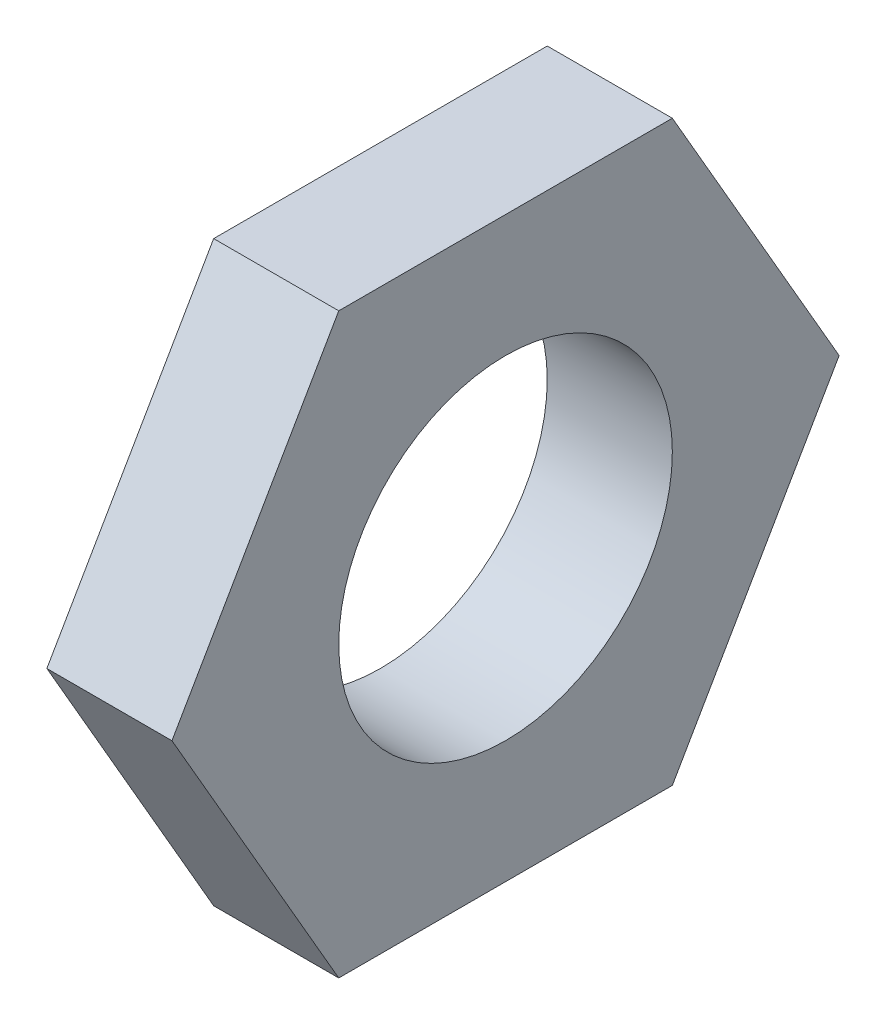
ISO-10303-21;
HEADER;
FILE_DESCRIPTION(('STEP AP214'),'2;1');
FILE_NAME('part.step','',(''),(''),'','','');
FILE_SCHEMA(('AUTOMOTIVE_DESIGN { 1 0 10303 214 1 1 1 1 }'));
ENDSEC;
DATA;
#1=APPLICATION_CONTEXT('core data for automotive mechanical design processes');
#2=APPLICATION_PROTOCOL_DEFINITION('international standard','automotive_design',2000,#1);
#3=PRODUCT_CONTEXT('',#1,'mechanical');
#4=PRODUCT('Part','Part','',(#3));
#5=PRODUCT_RELATED_PRODUCT_CATEGORY('part','',(#4));
#6=PRODUCT_DEFINITION_FORMATION('','',#4);
#7=PRODUCT_DEFINITION_CONTEXT('part definition',#1,'design');
#8=PRODUCT_DEFINITION('design','',#6,#7);
#9=PRODUCT_DEFINITION_SHAPE('','',#8);
#10=(LENGTH_UNIT() NAMED_UNIT(*) SI_UNIT(.MILLI.,.METRE.));
#11=(NAMED_UNIT(*) PLANE_ANGLE_UNIT() SI_UNIT($,.RADIAN.));
#12=(NAMED_UNIT(*) SI_UNIT($,.STERADIAN.) SOLID_ANGLE_UNIT());
#13=UNCERTAINTY_MEASURE_WITH_UNIT(LENGTH_MEASURE(1.E-05),#10,'distance_accuracy_value','');
#14=(GEOMETRIC_REPRESENTATION_CONTEXT(3) GLOBAL_UNCERTAINTY_ASSIGNED_CONTEXT((#13)) GLOBAL_UNIT_ASSIGNED_CONTEXT((#10,
#11,#12)) REPRESENTATION_CONTEXT('',''));
#15=CARTESIAN_POINT('',(0.,0.,0.));
#16=DIRECTION('',(0.,0.,1.));
#17=DIRECTION('',(1.,0.,0.));
#18=AXIS2_PLACEMENT_3D('',#15,#16,#17);
#19=CARTESIAN_POINT('',(3.,0.,0.));
#20=DIRECTION('',(1.,0.,0.));
#21=DIRECTION('',(0.,0.,-1.));
#22=AXIS2_PLACEMENT_3D('',#19,#20,#21);
#23=PLANE('',#22);
#24=DIRECTION('',(0.,0.866025403784439,-0.5));
#25=VECTOR('',#24,1.);
#26=CARTESIAN_POINT('',(3.,-6.92820323027551,-4.));
#27=LINE('',#26,#25);
#28=CARTESIAN_POINT('',(3.,-6.92820323027551,-4.));
#29=VERTEX_POINT('',#28);
#30=CARTESIAN_POINT('',(3.,0.,-8.));
#31=VERTEX_POINT('',#30);
#32=EDGE_CURVE('E129',#29,#31,#27,.T.);
#33=ORIENTED_EDGE('',*,*,#32,.T.);
#34=DIRECTION('',(0.,0.866025403784439,0.5));
#35=VECTOR('',#34,1.);
#36=CARTESIAN_POINT('',(3.,0.,-8.));
#37=LINE('',#36,#35);
#38=CARTESIAN_POINT('',(3.,6.92820323027551,-4.));
#39=VERTEX_POINT('',#38);
#40=EDGE_CURVE('E87',#31,#39,#37,.T.);
#41=ORIENTED_EDGE('',*,*,#40,.T.);
#42=DIRECTION('',(0.,0.,1.));
#43=VECTOR('',#42,1.);
#44=CARTESIAN_POINT('',(3.,6.92820323027551,-4.));
#45=LINE('',#44,#43);
#46=CARTESIAN_POINT('',(3.,6.92820323027551,4.));
#47=VERTEX_POINT('',#46);
#48=EDGE_CURVE('E100',#39,#47,#45,.T.);
#49=ORIENTED_EDGE('',*,*,#48,.T.);
#50=DIRECTION('',(0.,-0.866025403784439,0.5));
#51=VECTOR('',#50,1.);
#52=CARTESIAN_POINT('',(3.,6.92820323027551,4.));
#53=LINE('',#52,#51);
#54=CARTESIAN_POINT('',(3.,0.,8.));
#55=VERTEX_POINT('',#54);
#56=EDGE_CURVE('E94',#47,#55,#53,.T.);
#57=ORIENTED_EDGE('',*,*,#56,.T.);
#58=DIRECTION('',(0.,-0.866025403784439,-0.5));
#59=VECTOR('',#58,1.);
#60=CARTESIAN_POINT('',(3.,0.,8.));
#61=LINE('',#60,#59);
#62=CARTESIAN_POINT('',(3.,-6.92820323027551,4.));
#63=VERTEX_POINT('',#62);
#64=EDGE_CURVE('E98',#55,#63,#61,.T.);
#65=ORIENTED_EDGE('',*,*,#64,.T.);
#66=DIRECTION('',(0.,0.,-1.));
#67=VECTOR('',#66,1.);
#68=CARTESIAN_POINT('',(3.,-6.92820323027551,4.));
#69=LINE('',#68,#67);
#70=EDGE_CURVE('E50',#63,#29,#69,.T.);
#71=ORIENTED_EDGE('',*,*,#70,.T.);
#72=EDGE_LOOP('',(#33,#41,#49,#57,#65,#71));
#73=FACE_BOUND('',#72,.T.);
#74=CARTESIAN_POINT('',(3.,0.,0.));
#75=DIRECTION('',(1.,0.,0.));
#76=DIRECTION('',(0.,0.,-1.));
#77=AXIS2_PLACEMENT_3D('',#74,#75,#76);
#78=CIRCLE('',#77,4.);
#79=CARTESIAN_POINT('',(3.,0.,-4.));
#80=VERTEX_POINT('',#79);
#81=EDGE_CURVE('E122',#80,#80,#78,.T.);
#82=ORIENTED_EDGE('',*,*,#81,.F.);
#83=EDGE_LOOP('',(#82));
#84=FACE_BOUND('',#83,.T.);
#85=ADVANCED_FACE('F33',(#73,#84),#23,.T.);
#86=CARTESIAN_POINT('',(0.,0.,0.));
#87=DIRECTION('',(1.,0.,0.));
#88=DIRECTION('',(0.,0.,-1.));
#89=AXIS2_PLACEMENT_3D('',#86,#87,#88);
#90=PLANE('',#89);
#91=DIRECTION('',(0.,0.866025403784439,-0.5));
#92=VECTOR('',#91,1.);
#93=CARTESIAN_POINT('',(0.,-6.92820323027551,-4.));
#94=LINE('',#93,#92);
#95=CARTESIAN_POINT('',(0.,-6.92820323027551,-4.));
#96=VERTEX_POINT('',#95);
#97=CARTESIAN_POINT('',(0.,0.,-8.));
#98=VERTEX_POINT('',#97);
#99=EDGE_CURVE('E118',#96,#98,#94,.T.);
#100=ORIENTED_EDGE('',*,*,#99,.F.);
#101=DIRECTION('',(0.,0.,-1.));
#102=VECTOR('',#101,1.);
#103=CARTESIAN_POINT('',(0.,-6.92820323027551,4.));
#104=LINE('',#103,#102);
#105=CARTESIAN_POINT('',(0.,-6.92820323027551,4.));
#106=VERTEX_POINT('',#105);
#107=EDGE_CURVE('E79',#106,#96,#104,.T.);
#108=ORIENTED_EDGE('',*,*,#107,.F.);
#109=DIRECTION('',(0.,-0.866025403784439,-0.5));
#110=VECTOR('',#109,1.);
#111=CARTESIAN_POINT('',(0.,0.,8.));
#112=LINE('',#111,#110);
#113=CARTESIAN_POINT('',(0.,0.,8.));
#114=VERTEX_POINT('',#113);
#115=EDGE_CURVE('E73',#114,#106,#112,.T.);
#116=ORIENTED_EDGE('',*,*,#115,.F.);
#117=DIRECTION('',(0.,-0.866025403784439,0.5));
#118=VECTOR('',#117,1.);
#119=CARTESIAN_POINT('',(0.,6.92820323027551,4.));
#120=LINE('',#119,#118);
#121=CARTESIAN_POINT('',(0.,6.92820323027551,4.));
#122=VERTEX_POINT('',#121);
#123=EDGE_CURVE('E108',#122,#114,#120,.T.);
#124=ORIENTED_EDGE('',*,*,#123,.F.);
#125=DIRECTION('',(0.,0.,1.));
#126=VECTOR('',#125,1.);
#127=CARTESIAN_POINT('',(0.,6.92820323027551,-4.));
#128=LINE('',#127,#126);
#129=CARTESIAN_POINT('',(0.,6.92820323027551,-4.));
#130=VERTEX_POINT('',#129);
#131=EDGE_CURVE('E124',#130,#122,#128,.T.);
#132=ORIENTED_EDGE('',*,*,#131,.F.);
#133=DIRECTION('',(0.,0.866025403784439,0.5));
#134=VECTOR('',#133,1.);
#135=CARTESIAN_POINT('',(0.,0.,-8.));
#136=LINE('',#135,#134);
#137=EDGE_CURVE('E121',#98,#130,#136,.T.);
#138=ORIENTED_EDGE('',*,*,#137,.F.);
#139=EDGE_LOOP('',(#100,#108,#116,#124,#132,#138));
#140=FACE_BOUND('',#139,.T.);
#141=CARTESIAN_POINT('',(0.,0.,0.));
#142=DIRECTION('',(1.,0.,0.));
#143=DIRECTION('',(0.,0.,-1.));
#144=AXIS2_PLACEMENT_3D('',#141,#142,#143);
#145=CIRCLE('',#144,4.);
#146=CARTESIAN_POINT('',(0.,0.,-4.));
#147=VERTEX_POINT('',#146);
#148=EDGE_CURVE('E222',#147,#147,#145,.T.);
#149=ORIENTED_EDGE('',*,*,#148,.T.);
#150=EDGE_LOOP('',(#149));
#151=FACE_BOUND('',#150,.T.);
#152=ADVANCED_FACE('F138',(#140,#151),#90,.F.);
#153=CARTESIAN_POINT('',(3.,-6.92820323027551,-4.));
#154=DIRECTION('',(0.,0.5,0.866025403784439));
#155=DIRECTION('',(0.,-0.866025403784439,0.5));
#156=AXIS2_PLACEMENT_3D('',#153,#154,#155);
#157=PLANE('',#156);
#158=ORIENTED_EDGE('',*,*,#99,.T.);
#159=DIRECTION('',(-1.,0.,0.));
#160=VECTOR('',#159,1.);
#161=CARTESIAN_POINT('',(3.,0.,-8.));
#162=LINE('',#161,#160);
#163=EDGE_CURVE('E11',#31,#98,#162,.T.);
#164=ORIENTED_EDGE('',*,*,#163,.F.);
#165=ORIENTED_EDGE('',*,*,#32,.F.);
#166=DIRECTION('',(-1.,0.,0.));
#167=VECTOR('',#166,1.);
#168=CARTESIAN_POINT('',(3.,-6.92820323027551,-4.));
#169=LINE('',#168,#167);
#170=EDGE_CURVE('E114',#29,#96,#169,.T.);
#171=ORIENTED_EDGE('',*,*,#170,.T.);
#172=EDGE_LOOP('',(#158,#164,#165,#171));
#173=FACE_BOUND('',#172,.T.);
#174=ADVANCED_FACE('F35',(#173),#157,.F.);
#175=CARTESIAN_POINT('',(3.,0.,-8.));
#176=DIRECTION('',(0.,-0.5,0.866025403784439));
#177=DIRECTION('',(0.,-0.866025403784439,-0.5));
#178=AXIS2_PLACEMENT_3D('',#175,#176,#177);
#179=PLANE('',#178);
#180=ORIENTED_EDGE('',*,*,#137,.T.);
#181=DIRECTION('',(-1.,0.,0.));
#182=VECTOR('',#181,1.);
#183=CARTESIAN_POINT('',(3.,6.92820323027551,-4.));
#184=LINE('',#183,#182);
#185=EDGE_CURVE('E42',#39,#130,#184,.T.);
#186=ORIENTED_EDGE('',*,*,#185,.F.);
#187=ORIENTED_EDGE('',*,*,#40,.F.);
#188=ORIENTED_EDGE('',*,*,#163,.T.);
#189=EDGE_LOOP('',(#180,#186,#187,#188));
#190=FACE_BOUND('',#189,.T.);
#191=ADVANCED_FACE('F163',(#190),#179,.F.);
#192=CARTESIAN_POINT('',(3.,6.92820323027551,-4.));
#193=DIRECTION('',(0.,-1.,0.));
#194=DIRECTION('',(0.,0.,-1.));
#195=AXIS2_PLACEMENT_3D('',#192,#193,#194);
#196=PLANE('',#195);
#197=ORIENTED_EDGE('',*,*,#131,.T.);
#198=DIRECTION('',(-1.,0.,0.));
#199=VECTOR('',#198,1.);
#200=CARTESIAN_POINT('',(3.,6.92820323027551,4.));
#201=LINE('',#200,#199);
#202=EDGE_CURVE('E109',#47,#122,#201,.T.);
#203=ORIENTED_EDGE('',*,*,#202,.F.);
#204=ORIENTED_EDGE('',*,*,#48,.F.);
#205=ORIENTED_EDGE('',*,*,#185,.T.);
#206=EDGE_LOOP('',(#197,#203,#204,#205));
#207=FACE_BOUND('',#206,.T.);
#208=ADVANCED_FACE('F135',(#207),#196,.F.);
#209=CARTESIAN_POINT('',(3.,6.92820323027551,4.));
#210=DIRECTION('',(0.,-0.5,-0.866025403784438));
#211=DIRECTION('',(0.,0.866025403784439,-0.5));
#212=AXIS2_PLACEMENT_3D('',#209,#210,#211);
#213=PLANE('',#212);
#214=ORIENTED_EDGE('',*,*,#123,.T.);
#215=DIRECTION('',(-1.,0.,0.));
#216=VECTOR('',#215,1.);
#217=CARTESIAN_POINT('',(3.,0.,8.));
#218=LINE('',#217,#216);
#219=EDGE_CURVE('E105',#55,#114,#218,.T.);
#220=ORIENTED_EDGE('',*,*,#219,.F.);
#221=ORIENTED_EDGE('',*,*,#56,.F.);
#222=ORIENTED_EDGE('',*,*,#202,.T.);
#223=EDGE_LOOP('',(#214,#220,#221,#222));
#224=FACE_BOUND('',#223,.T.);
#225=ADVANCED_FACE('F106',(#224),#213,.F.);
#226=CARTESIAN_POINT('',(3.,0.,8.));
#227=DIRECTION('',(0.,0.5,-0.866025403784439));
#228=DIRECTION('',(0.,0.866025403784439,0.5));
#229=AXIS2_PLACEMENT_3D('',#226,#227,#228);
#230=PLANE('',#229);
#231=ORIENTED_EDGE('',*,*,#115,.T.);
#232=DIRECTION('',(-1.,0.,0.));
#233=VECTOR('',#232,1.);
#234=CARTESIAN_POINT('',(3.,-6.92820323027551,4.));
#235=LINE('',#234,#233);
#236=EDGE_CURVE('E110',#63,#106,#235,.T.);
#237=ORIENTED_EDGE('',*,*,#236,.F.);
#238=ORIENTED_EDGE('',*,*,#64,.F.);
#239=ORIENTED_EDGE('',*,*,#219,.T.);
#240=EDGE_LOOP('',(#231,#237,#238,#239));
#241=FACE_BOUND('',#240,.T.);
#242=ADVANCED_FACE('F112',(#241),#230,.F.);
#243=CARTESIAN_POINT('',(3.,-6.92820323027551,4.));
#244=DIRECTION('',(0.,1.,0.));
#245=DIRECTION('',(0.,0.,1.));
#246=AXIS2_PLACEMENT_3D('',#243,#244,#245);
#247=PLANE('',#246);
#248=ORIENTED_EDGE('',*,*,#107,.T.);
#249=ORIENTED_EDGE('',*,*,#170,.F.);
#250=ORIENTED_EDGE('',*,*,#70,.F.);
#251=ORIENTED_EDGE('',*,*,#236,.T.);
#252=EDGE_LOOP('',(#248,#249,#250,#251));
#253=FACE_BOUND('',#252,.T.);
#254=ADVANCED_FACE('F143',(#253),#247,.F.);
#255=CARTESIAN_POINT('',(3.,0.,0.));
#256=DIRECTION('',(-1.,0.,0.));
#257=DIRECTION('',(0.,0.,1.));
#258=AXIS2_PLACEMENT_3D('',#255,#256,#257);
#259=CYLINDRICAL_SURFACE('',#258,4.);
#260=ORIENTED_EDGE('',*,*,#81,.T.);
#261=EDGE_LOOP('',(#260));
#262=FACE_BOUND('',#261,.T.);
#263=ORIENTED_EDGE('',*,*,#148,.F.);
#264=EDGE_LOOP('',(#263));
#265=FACE_BOUND('',#264,.T.);
#266=ADVANCED_FACE('F145',(#262,#265),#259,.F.);
#267=CLOSED_SHELL('',(#85,#152,#174,#191,#208,#225,#242,#254,#266));
#268=MANIFOLD_SOLID_BREP('B2',#267);
#269=ADVANCED_BREP_SHAPE_REPRESENTATION('',(#18,#268),#14);
#270=SHAPE_DEFINITION_REPRESENTATION(#9,#269);
ENDSEC;
END-ISO-10303-21;
